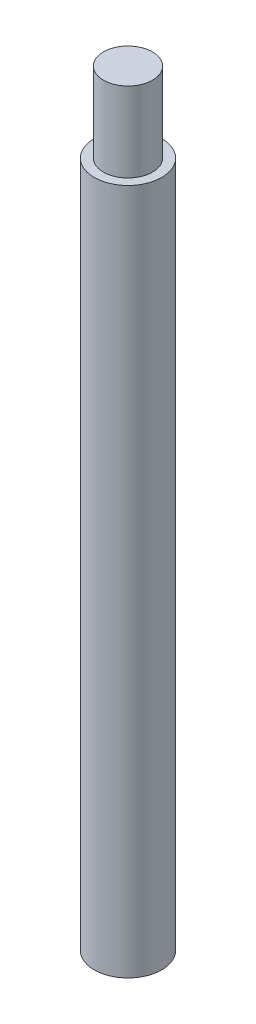
ISO-10303-21;
HEADER;
FILE_DESCRIPTION(('STEP AP214'),'2;1');
FILE_NAME('part.step','',(''),(''),'','','');
FILE_SCHEMA(('AUTOMOTIVE_DESIGN { 1 0 10303 214 1 1 1 1 }'));
ENDSEC;
DATA;
#1=APPLICATION_CONTEXT('core data for automotive mechanical design processes');
#2=APPLICATION_PROTOCOL_DEFINITION('international standard','automotive_design',2000,#1);
#3=PRODUCT_CONTEXT('',#1,'mechanical');
#4=PRODUCT('Part','Part','',(#3));
#5=PRODUCT_RELATED_PRODUCT_CATEGORY('part','',(#4));
#6=PRODUCT_DEFINITION_FORMATION('','',#4);
#7=PRODUCT_DEFINITION_CONTEXT('part definition',#1,'design');
#8=PRODUCT_DEFINITION('design','',#6,#7);
#9=PRODUCT_DEFINITION_SHAPE('','',#8);
#10=(LENGTH_UNIT() NAMED_UNIT(*) SI_UNIT(.MILLI.,.METRE.));
#11=(NAMED_UNIT(*) PLANE_ANGLE_UNIT() SI_UNIT($,.RADIAN.));
#12=(NAMED_UNIT(*) SI_UNIT($,.STERADIAN.) SOLID_ANGLE_UNIT());
#13=UNCERTAINTY_MEASURE_WITH_UNIT(LENGTH_MEASURE(1.E-05),#10,'distance_accuracy_value','');
#14=(GEOMETRIC_REPRESENTATION_CONTEXT(3) GLOBAL_UNCERTAINTY_ASSIGNED_CONTEXT((#13)) GLOBAL_UNIT_ASSIGNED_CONTEXT((#10,
#11,#12)) REPRESENTATION_CONTEXT('',''));
#15=CARTESIAN_POINT('',(0.,0.,0.));
#16=DIRECTION('',(0.,0.,1.));
#17=DIRECTION('',(1.,0.,0.));
#18=AXIS2_PLACEMENT_3D('',#15,#16,#17);
#19=CARTESIAN_POINT('',(0.,355.6,0.));
#20=DIRECTION('',(0.,1.,0.));
#21=DIRECTION('',(0.,0.,1.));
#22=AXIS2_PLACEMENT_3D('',#19,#20,#21);
#23=PLANE('',#22);
#24=CARTESIAN_POINT('',(0.,355.6,0.));
#25=DIRECTION('',(0.,1.,0.));
#26=DIRECTION('',(0.,0.,1.));
#27=AXIS2_PLACEMENT_3D('',#24,#25,#26);
#28=CIRCLE('',#27,17.4625);
#29=CARTESIAN_POINT('',(0.,355.6,17.4625));
#30=VERTEX_POINT('',#29);
#31=EDGE_CURVE('E10',#30,#30,#28,.T.);
#32=ORIENTED_EDGE('',*,*,#31,.T.);
#33=EDGE_LOOP('',(#32));
#34=FACE_BOUND('',#33,.T.);
#35=CARTESIAN_POINT('',(0.,355.6,0.));
#36=DIRECTION('',(0.,1.,0.));
#37=DIRECTION('',(0.,0.,1.));
#38=AXIS2_PLACEMENT_3D('',#35,#36,#37);
#39=CIRCLE('',#38,12.7);
#40=CARTESIAN_POINT('',(0.,355.6,12.7));
#41=VERTEX_POINT('',#40);
#42=EDGE_CURVE('E45',#41,#41,#39,.T.);
#43=ORIENTED_EDGE('',*,*,#42,.F.);
#44=EDGE_LOOP('',(#43));
#45=FACE_BOUND('',#44,.T.);
#46=ADVANCED_FACE('F32',(#34,#45),#23,.T.);
#47=CARTESIAN_POINT('',(0.,355.6,0.));
#48=DIRECTION('',(0.,-1.,0.));
#49=DIRECTION('',(0.,0.,-1.));
#50=AXIS2_PLACEMENT_3D('',#47,#48,#49);
#51=CYLINDRICAL_SURFACE('',#50,17.4625);
#52=ORIENTED_EDGE('',*,*,#31,.F.);
#53=EDGE_LOOP('',(#52));
#54=FACE_BOUND('',#53,.T.);
#55=CARTESIAN_POINT('',(0.,0.,0.));
#56=DIRECTION('',(0.,1.,0.));
#57=DIRECTION('',(0.,0.,1.));
#58=AXIS2_PLACEMENT_3D('',#55,#56,#57);
#59=CIRCLE('',#58,17.4625);
#60=CARTESIAN_POINT('',(0.,0.,17.4625));
#61=VERTEX_POINT('',#60);
#62=EDGE_CURVE('E36',#61,#61,#59,.T.);
#63=ORIENTED_EDGE('',*,*,#62,.T.);
#64=EDGE_LOOP('',(#63));
#65=FACE_BOUND('',#64,.T.);
#66=ADVANCED_FACE('F34',(#54,#65),#51,.T.);
#67=CARTESIAN_POINT('',(0.,0.,0.));
#68=DIRECTION('',(0.,1.,0.));
#69=DIRECTION('',(0.,0.,1.));
#70=AXIS2_PLACEMENT_3D('',#67,#68,#69);
#71=PLANE('',#70);
#72=ORIENTED_EDGE('',*,*,#62,.F.);
#73=EDGE_LOOP('',(#72));
#74=FACE_BOUND('',#73,.T.);
#75=ADVANCED_FACE('F56',(#74),#71,.F.);
#76=CARTESIAN_POINT('',(0.,396.875,0.));
#77=DIRECTION('',(0.,-1.,0.));
#78=DIRECTION('',(0.,0.,-1.));
#79=AXIS2_PLACEMENT_3D('',#76,#77,#78);
#80=CYLINDRICAL_SURFACE('',#79,12.7);
#81=CARTESIAN_POINT('',(0.,396.875,0.));
#82=DIRECTION('',(0.,1.,0.));
#83=DIRECTION('',(0.,0.,1.));
#84=AXIS2_PLACEMENT_3D('',#81,#82,#83);
#85=CIRCLE('',#84,12.7);
#86=CARTESIAN_POINT('',(0.,396.875,12.7));
#87=VERTEX_POINT('',#86);
#88=EDGE_CURVE('E43',#87,#87,#85,.T.);
#89=ORIENTED_EDGE('',*,*,#88,.F.);
#90=EDGE_LOOP('',(#89));
#91=FACE_BOUND('',#90,.T.);
#92=ORIENTED_EDGE('',*,*,#42,.T.);
#93=EDGE_LOOP('',(#92));
#94=FACE_BOUND('',#93,.T.);
#95=ADVANCED_FACE('F53',(#91,#94),#80,.T.);
#96=CARTESIAN_POINT('',(0.,396.875,0.));
#97=DIRECTION('',(0.,1.,0.));
#98=DIRECTION('',(0.,0.,1.));
#99=AXIS2_PLACEMENT_3D('',#96,#97,#98);
#100=PLANE('',#99);
#101=ORIENTED_EDGE('',*,*,#88,.T.);
#102=EDGE_LOOP('',(#101));
#103=FACE_BOUND('',#102,.T.);
#104=ADVANCED_FACE('F51',(#103),#100,.T.);
#105=CLOSED_SHELL('',(#46,#66,#75,#95,#104));
#106=MANIFOLD_SOLID_BREP('B2',#105);
#107=ADVANCED_BREP_SHAPE_REPRESENTATION('',(#18,#106),#14);
#108=SHAPE_DEFINITION_REPRESENTATION(#9,#107);
ENDSEC;
END-ISO-10303-21;
